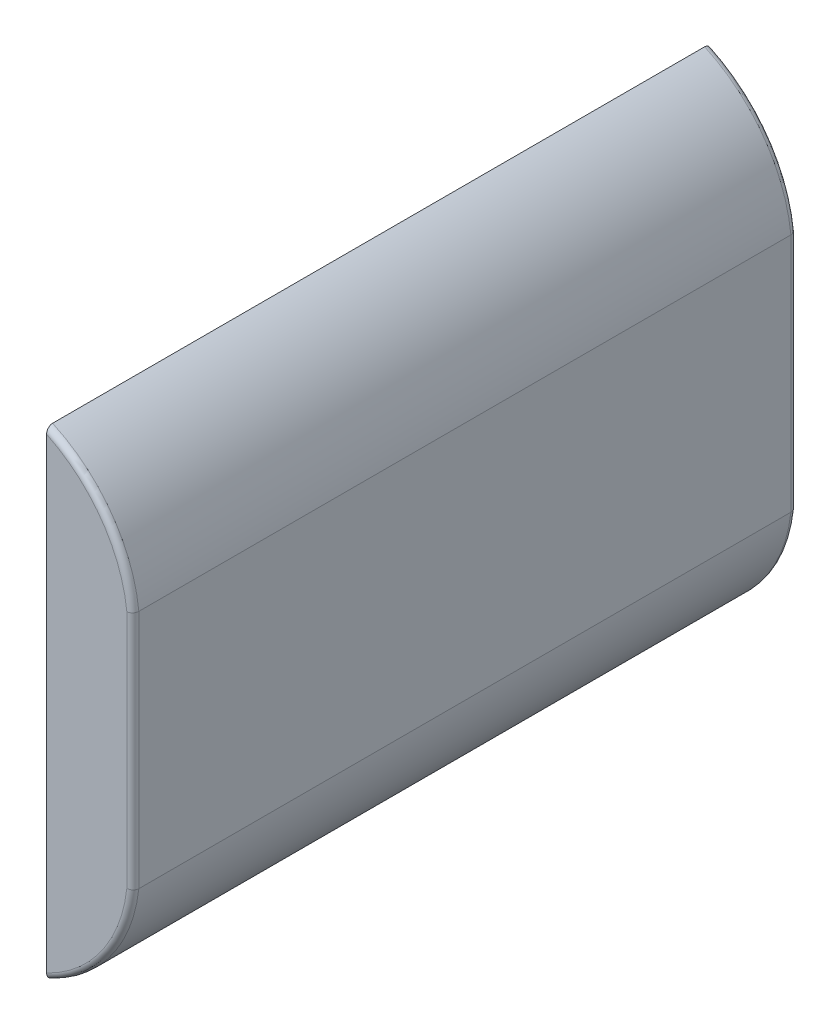
ISO-10303-21;
HEADER;
FILE_DESCRIPTION(('STEP AP214'),'2;1');
FILE_NAME('part.step','',(''),(''),'','','');
FILE_SCHEMA(('AUTOMOTIVE_DESIGN { 1 0 10303 214 1 1 1 1 }'));
ENDSEC;
DATA;
#1=APPLICATION_CONTEXT('core data for automotive mechanical design processes');
#2=APPLICATION_PROTOCOL_DEFINITION('international standard','automotive_design',2000,#1);
#3=PRODUCT_CONTEXT('',#1,'mechanical');
#4=PRODUCT('Part','Part','',(#3));
#5=PRODUCT_RELATED_PRODUCT_CATEGORY('part','',(#4));
#6=PRODUCT_DEFINITION_FORMATION('','',#4);
#7=PRODUCT_DEFINITION_CONTEXT('part definition',#1,'design');
#8=PRODUCT_DEFINITION('design','',#6,#7);
#9=PRODUCT_DEFINITION_SHAPE('','',#8);
#10=(LENGTH_UNIT() NAMED_UNIT(*) SI_UNIT(.MILLI.,.METRE.));
#11=(NAMED_UNIT(*) PLANE_ANGLE_UNIT() SI_UNIT($,.RADIAN.));
#12=(NAMED_UNIT(*) SI_UNIT($,.STERADIAN.) SOLID_ANGLE_UNIT());
#13=UNCERTAINTY_MEASURE_WITH_UNIT(LENGTH_MEASURE(1.E-05),#10,'distance_accuracy_value','');
#14=(GEOMETRIC_REPRESENTATION_CONTEXT(3) GLOBAL_UNCERTAINTY_ASSIGNED_CONTEXT((#13)) GLOBAL_UNIT_ASSIGNED_CONTEXT((#10,
#11,#12)) REPRESENTATION_CONTEXT('',''));
#15=CARTESIAN_POINT('',(0.,0.,0.));
#16=DIRECTION('',(0.,0.,1.));
#17=DIRECTION('',(1.,0.,0.));
#18=AXIS2_PLACEMENT_3D('',#15,#16,#17);
#19=CARTESIAN_POINT('',(0.,0.,110.6));
#20=DIRECTION('',(1.,0.,0.));
#21=DIRECTION('',(0.,0.,-1.));
#22=AXIS2_PLACEMENT_3D('',#19,#20,#21);
#23=PLANE('',#22);
#24=DIRECTION('',(0.,0.,-1.));
#25=VECTOR('',#24,1.);
#26=CARTESIAN_POINT('',(0.,0.,110.6));
#27=LINE('',#26,#25);
#28=CARTESIAN_POINT('',(0.,0.,109.6));
#29=VERTEX_POINT('',#28);
#30=CARTESIAN_POINT('',(0.,0.,1.));
#31=VERTEX_POINT('',#30);
#32=EDGE_CURVE('E166',#29,#31,#27,.T.);
#33=ORIENTED_EDGE('',*,*,#32,.F.);
#34=CARTESIAN_POINT('',(0.,0.,109.6));
#35=CARTESIAN_POINT('',(0.,-1.08799651846304E-06,109.626272334816));
#36=CARTESIAN_POINT('',(0.,0.00113977934455245,109.65253138727));
#37=CARTESIAN_POINT('',(0.,0.00568252953161637,109.704847250998));
#38=CARTESIAN_POINT('',(0.,0.00908389604878885,109.730904107082));
#39=CARTESIAN_POINT('',(0.,0.0226090273595266,109.808318948475));
#40=CARTESIAN_POINT('',(0.,0.0360542489907654,109.859134129471));
#41=CARTESIAN_POINT('',(0.,0.071236565805116,109.95774085126));
#42=CARTESIAN_POINT('',(0.,0.0929704742375248,110.005533545885));
#43=CARTESIAN_POINT('',(0.,0.143889601691275,110.096987112773));
#44=CARTESIAN_POINT('',(0.,0.173078605941792,110.140645870601));
#45=CARTESIAN_POINT('',(0.,0.239043360605673,110.22434878721));
#46=CARTESIAN_POINT('',(0.,0.27605290690079,110.264208078419));
#47=CARTESIAN_POINT('',(0.,0.355757506544396,110.337745180802));
#48=CARTESIAN_POINT('',(0.,0.398453796104587,110.371421644125));
#49=CARTESIAN_POINT('',(0.,0.492213654701837,110.43473000306));
#50=CARTESIAN_POINT('',(0.,0.543681242911641,110.463762909465));
#51=CARTESIAN_POINT('',(0.,0.650474577970152,110.513616583938));
#52=CARTESIAN_POINT('',(0.,0.705803199778973,110.534431154098));
#53=CARTESIAN_POINT('',(0.,0.817942886603018,110.567356852068));
#54=CARTESIAN_POINT('',(0.,0.874712208288021,110.579611230666));
#55=CARTESIAN_POINT('',(0.,0.989313705434746,110.595931466646));
#56=CARTESIAN_POINT('',(0.,1.04714376595589,110.600012138445));
#57=CARTESIAN_POINT('',(0.,1.10495705147508,110.6));
#58=B_SPLINE_CURVE_WITH_KNOTS('',3,(#34,#35,#36,#37,#38,#39,#40,#41,#42,#43,#44,#45,#46,#47,#48,
#49,#50,#51,#52,#53,#54,#55,#56,#57),.UNSPECIFIED.,.F.,.F.,(4,2,2,2,2,2,2,2,2,2,2,4),(0.,
0.0787662157653202,0.157514446434087,0.314380654845202,0.471186613619989,0.62807234743109,
0.790563183127081,0.953089399693553,1.12962729872248,1.30629808172443,1.47993655517551,
1.6532600321612),.UNSPECIFIED.);
#59=CARTESIAN_POINT('',(0.,1.10495705147508,110.6));
#60=VERTEX_POINT('',#59);
#61=EDGE_CURVE('E226',#29,#60,#58,.T.);
#62=ORIENTED_EDGE('',*,*,#61,.T.);
#63=DIRECTION('',(0.,-1.,0.));
#64=VECTOR('',#63,1.);
#65=CARTESIAN_POINT('',(0.,0.,110.6));
#66=LINE('',#65,#64);
#67=CARTESIAN_POINT('',(0.,78.7950429485249,110.6));
#68=VERTEX_POINT('',#67);
#69=EDGE_CURVE('E163',#68,#60,#66,.T.);
#70=ORIENTED_EDGE('',*,*,#69,.F.);
#71=CARTESIAN_POINT('',(0.,78.7950429485249,110.6));
#72=CARTESIAN_POINT('',(0.,78.8624456769818,110.60002474272));
#73=CARTESIAN_POINT('',(0.,78.9298849646688,110.594469660355));
#74=CARTESIAN_POINT('',(0.,79.0631112047222,110.572262518221));
#75=CARTESIAN_POINT('',(0.,79.1288926508186,110.555577528095));
#76=CARTESIAN_POINT('',(0.,79.2567696696953,110.511134003817));
#77=CARTESIAN_POINT('',(0.,79.3188583645859,110.483355506606));
#78=CARTESIAN_POINT('',(0.,79.4370024507866,110.417128880177));
#79=CARTESIAN_POINT('',(0.,79.493065564149,110.378694638585));
#80=CARTESIAN_POINT('',(0.,79.5937162943656,110.294599131112));
#81=CARTESIAN_POINT('',(0.,79.6387995985411,110.249532922222));
#82=CARTESIAN_POINT('',(0.,79.7197590633968,110.151721806559));
#83=CARTESIAN_POINT('',(0.,79.7556370382433,110.098978416003));
#84=CARTESIAN_POINT('',(0.,79.8133448004414,109.992992908201));
#85=CARTESIAN_POINT('',(0.,79.836211536672,109.940313676081));
#86=CARTESIAN_POINT('',(0.,79.8718672736259,109.831699343526));
#87=CARTESIAN_POINT('',(0.,79.8846776637116,109.775771426692));
#88=CARTESIAN_POINT('',(0.,79.8947678544994,109.699447783751));
#89=CARTESIAN_POINT('',(0.,79.896729910866,109.67959352864));
#90=CARTESIAN_POINT('',(0.,79.8993442912994,109.639829605312));
#91=CARTESIAN_POINT('',(0.,79.8999986242182,109.619920069207));
#92=CARTESIAN_POINT('',(0.,79.9,109.6));
#93=B_SPLINE_CURVE_WITH_KNOTS('',3,(#71,#72,#73,#74,#75,#76,#77,#78,#79,#80,#81,#82,#83,#84,#85,
#86,#87,#88,#89,#90,#91,#92),.UNSPECIFIED.,.F.,.F.,(4,2,2,2,2,2,2,2,2,2,4),(0.,
0.202040832621679,0.404682116113837,0.60768971307525,0.810433964114684,1.00062091789273,
1.19077036119936,1.36215465073271,1.53317341897741,1.59299388506299,1.65272238743571),.UNSPECIFIED.);
#94=CARTESIAN_POINT('',(0.,79.9,109.6));
#95=VERTEX_POINT('',#94);
#96=EDGE_CURVE('E220',#68,#95,#93,.T.);
#97=ORIENTED_EDGE('',*,*,#96,.T.);
#98=DIRECTION('',(0.,0.,-1.));
#99=VECTOR('',#98,1.);
#100=CARTESIAN_POINT('',(0.,79.9,110.6));
#101=LINE('',#100,#99);
#102=CARTESIAN_POINT('',(0.,79.9,1.));
#103=VERTEX_POINT('',#102);
#104=EDGE_CURVE('E172',#95,#103,#101,.T.);
#105=ORIENTED_EDGE('',*,*,#104,.T.);
#106=CARTESIAN_POINT('',(0.,79.9,1.));
#107=CARTESIAN_POINT('',(0.,79.9000010879965,0.973727665183909));
#108=CARTESIAN_POINT('',(0.,79.8988602206554,0.947468612730248));
#109=CARTESIAN_POINT('',(0.,79.8943174704684,0.895152749002102));
#110=CARTESIAN_POINT('',(0.,79.8909161039512,0.869095892917911));
#111=CARTESIAN_POINT('',(0.,79.8773909726405,0.791681051525214));
#112=CARTESIAN_POINT('',(0.,79.8639457510092,0.740865870529047));
#113=CARTESIAN_POINT('',(0.,79.8287634341949,0.642259148740017));
#114=CARTESIAN_POINT('',(0.,79.8070295257625,0.594466454114742));
#115=CARTESIAN_POINT('',(0.,79.7561103983087,0.503012887226715));
#116=CARTESIAN_POINT('',(0.,79.7269213940582,0.459354129398735));
#117=CARTESIAN_POINT('',(0.,79.6609566393943,0.375651212790312));
#118=CARTESIAN_POINT('',(0.,79.6239470930992,0.335791921580795));
#119=CARTESIAN_POINT('',(0.,79.5442424934556,0.262254819198293));
#120=CARTESIAN_POINT('',(0.,79.5015462038954,0.228578355874951));
#121=CARTESIAN_POINT('',(0.,79.4077863452982,0.165269996940359));
#122=CARTESIAN_POINT('',(0.,79.3563187570884,0.136237090535357));
#123=CARTESIAN_POINT('',(0.,79.2495254220299,0.0863834160622846));
#124=CARTESIAN_POINT('',(0.,79.194196800221,0.0655688459017625));
#125=CARTESIAN_POINT('',(0.,79.082057113397,0.0326431479315622));
#126=CARTESIAN_POINT('',(0.,79.025287791712,0.02038876933447));
#127=CARTESIAN_POINT('',(0.,78.9106862945653,0.00406853335437581));
#128=CARTESIAN_POINT('',(0.,78.8528562340441,-1.2138445214292E-05));
#129=CARTESIAN_POINT('',(0.,78.7950429485249,0.));
#130=B_SPLINE_CURVE_WITH_KNOTS('',3,(#106,#107,#108,#109,#110,#111,#112,#113,#114,#115,#116,
#117,#118,#119,#120,#121,#122,#123,#124,#125,#126,#127,#128,#129),.UNSPECIFIED.,.F.,.F.,(4,2,2,
2,2,2,2,2,2,2,2,4),(0.,0.0787662157653061,0.157514446434061,0.314380654845193,0.471186613620007,
0.628072347431094,0.79056318312707,0.953089399693543,1.12962729872247,1.30629808172441,
1.47993655517549,1.6532600321612),.UNSPECIFIED.);
#131=CARTESIAN_POINT('',(0.,78.7950429485249,0.));
#132=VERTEX_POINT('',#131);
#133=EDGE_CURVE('E199',#103,#132,#130,.T.);
#134=ORIENTED_EDGE('',*,*,#133,.T.);
#135=DIRECTION('',(0.,-1.,0.));
#136=VECTOR('',#135,1.);
#137=CARTESIAN_POINT('',(0.,0.,0.));
#138=LINE('',#137,#136);
#139=CARTESIAN_POINT('',(0.,1.10495705147508,0.));
#140=VERTEX_POINT('',#139);
#141=EDGE_CURVE('E167',#132,#140,#138,.T.);
#142=ORIENTED_EDGE('',*,*,#141,.T.);
#143=CARTESIAN_POINT('',(0.,1.10495705147508,0.));
#144=CARTESIAN_POINT('',(0.,1.03755432301821,-2.47427200257199E-05));
#145=CARTESIAN_POINT('',(0.,0.970115035331252,0.00553033964526887));
#146=CARTESIAN_POINT('',(0.,0.83688879527781,0.0277374817792062));
#147=CARTESIAN_POINT('',(0.,0.771107349181369,0.044422471904687));
#148=CARTESIAN_POINT('',(0.,0.643230330304724,0.0888659961826639));
#149=CARTESIAN_POINT('',(0.,0.581141635414134,0.11664449339376));
#150=CARTESIAN_POINT('',(0.,0.462997549213377,0.182871119823299));
#151=CARTESIAN_POINT('',(0.,0.406934435850963,0.221305361415079));
#152=CARTESIAN_POINT('',(0.,0.30628370563441,0.30540086888796));
#153=CARTESIAN_POINT('',(0.,0.261200401458897,0.350467077777677));
#154=CARTESIAN_POINT('',(0.,0.180240936603185,0.448278193441358));
#155=CARTESIAN_POINT('',(0.,0.144362961756702,0.501021583996783));
#156=CARTESIAN_POINT('',(0.,0.0866551995585624,0.607007091799195));
#157=CARTESIAN_POINT('',(0.,0.0637884633279871,0.659686323919291));
#158=CARTESIAN_POINT('',(0.,0.0281327263741241,0.768300656473866));
#159=CARTESIAN_POINT('',(0.,0.015322336288431,0.824228573307906));
#160=CARTESIAN_POINT('',(0.,0.00523214550059529,0.9005522162489));
#161=CARTESIAN_POINT('',(0.,0.00327008913402423,0.92040647136046));
#162=CARTESIAN_POINT('',(0.,0.000655708700552523,0.960170394688015));
#163=CARTESIAN_POINT('',(0.,1.37578182343753E-06,0.980079930792728));
#164=CARTESIAN_POINT('',(0.,0.,1.));
#165=B_SPLINE_CURVE_WITH_KNOTS('',3,(#143,#144,#145,#146,#147,#148,#149,#150,#151,#152,#153,
#154,#155,#156,#157,#158,#159,#160,#161,#162,#163,#164),.UNSPECIFIED.,.F.,.F.,(4,2,2,2,2,2,2,2,
2,2,4),(0.,0.202040832621676,0.404682116113837,0.607689713075251,0.810433964114681,
1.00062091789273,1.19077036119936,1.3621546507327,1.5331734189774,1.59299388506299,
1.6527223874357),.UNSPECIFIED.);
#166=EDGE_CURVE('E192',#140,#31,#165,.T.);
#167=ORIENTED_EDGE('',*,*,#166,.T.);
#168=EDGE_LOOP('',(#33,#62,#70,#97,#105,#134,#142,#167));
#169=FACE_BOUND('',#168,.T.);
#170=DIRECTION('',(0.,-1.,0.));
#171=VECTOR('',#170,1.);
#172=CARTESIAN_POINT('',(0.,0.,1.8));
#173=LINE('',#172,#171);
#174=CARTESIAN_POINT('',(0.,77.9033592474587,1.8));
#175=VERTEX_POINT('',#174);
#176=CARTESIAN_POINT('',(0.,1.99664075254128,1.8));
#177=VERTEX_POINT('',#176);
#178=EDGE_CURVE('E148',#175,#177,#173,.T.);
#179=ORIENTED_EDGE('',*,*,#178,.F.);
#180=DIRECTION('',(0.,0.,-1.));
#181=VECTOR('',#180,1.);
#182=CARTESIAN_POINT('',(0.,77.9033592474587,108.8));
#183=LINE('',#182,#181);
#184=CARTESIAN_POINT('',(0.,77.9033592474587,108.8));
#185=VERTEX_POINT('',#184);
#186=EDGE_CURVE('E143',#185,#175,#183,.T.);
#187=ORIENTED_EDGE('',*,*,#186,.F.);
#188=DIRECTION('',(0.,-1.,0.));
#189=VECTOR('',#188,1.);
#190=CARTESIAN_POINT('',(0.,0.,108.8));
#191=LINE('',#190,#189);
#192=CARTESIAN_POINT('',(0.,1.99664075254128,108.8));
#193=VERTEX_POINT('',#192);
#194=EDGE_CURVE('E156',#185,#193,#191,.T.);
#195=ORIENTED_EDGE('',*,*,#194,.T.);
#196=DIRECTION('',(0.,0.,-1.));
#197=VECTOR('',#196,1.);
#198=CARTESIAN_POINT('',(0.,1.99664075254128,108.8));
#199=LINE('',#198,#197);
#200=EDGE_CURVE('E157',#193,#177,#199,.T.);
#201=ORIENTED_EDGE('',*,*,#200,.T.);
#202=EDGE_LOOP('',(#179,#187,#195,#201));
#203=FACE_BOUND('',#202,.T.);
#204=ADVANCED_FACE('F32',(#169,#203),#23,.F.);
#205=CARTESIAN_POINT('',(-10.3617105858602,22.6028396881651,110.6));
#206=DIRECTION('',(0.,0.,-1.));
#207=DIRECTION('',(-1.,0.,0.));
#208=AXIS2_PLACEMENT_3D('',#205,#206,#207);
#209=CYLINDRICAL_SURFACE('',#208,24.8647020539965);
#210=DIRECTION('',(0.,0.,-1.));
#211=VECTOR('',#210,1.);
#212=CARTESIAN_POINT('',(14.3610693917822,19.95,110.6));
#213=LINE('',#212,#211);
#214=CARTESIAN_POINT('',(14.3610693917822,19.95,109.6));
#215=VERTEX_POINT('',#214);
#216=CARTESIAN_POINT('',(14.3610693917822,19.95,1.));
#217=VERTEX_POINT('',#216);
#218=EDGE_CURVE('E178',#215,#217,#213,.T.);
#219=ORIENTED_EDGE('',*,*,#218,.F.);
#220=CARTESIAN_POINT('',(-10.3617105858602,22.6028396881651,109.6));
#221=DIRECTION('',(0.,0.,1.));
#222=DIRECTION('',(1.,0.,0.));
#223=AXIS2_PLACEMENT_3D('',#220,#221,#222);
#224=CIRCLE('',#223,24.8647020539965);
#225=EDGE_CURVE('E190',#215,#29,#224,.F.);
#226=ORIENTED_EDGE('',*,*,#225,.T.);
#227=ORIENTED_EDGE('',*,*,#32,.T.);
#228=CARTESIAN_POINT('',(-10.3617105858602,22.6028396881651,1.));
#229=DIRECTION('',(0.,0.,1.));
#230=DIRECTION('',(1.,0.,0.));
#231=AXIS2_PLACEMENT_3D('',#228,#229,#230);
#232=CIRCLE('',#231,24.8647020539965);
#233=EDGE_CURVE('E188',#31,#217,#232,.T.);
#234=ORIENTED_EDGE('',*,*,#233,.T.);
#235=EDGE_LOOP('',(#219,#226,#227,#234));
#236=FACE_BOUND('',#235,.T.);
#237=ADVANCED_FACE('F210',(#236),#209,.T.);
#238=CARTESIAN_POINT('',(14.3610693917822,19.95,110.6));
#239=DIRECTION('',(-1.,0.,0.));
#240=DIRECTION('',(0.,0.,1.));
#241=AXIS2_PLACEMENT_3D('',#238,#239,#240);
#242=PLANE('',#241);
#243=DIRECTION('',(0.,0.,-1.));
#244=VECTOR('',#243,1.);
#245=CARTESIAN_POINT('',(14.3610693917822,59.95,110.6));
#246=LINE('',#245,#244);
#247=CARTESIAN_POINT('',(14.3610693917822,59.95,109.6));
#248=VERTEX_POINT('',#247);
#249=CARTESIAN_POINT('',(14.3610693917822,59.95,1.));
#250=VERTEX_POINT('',#249);
#251=EDGE_CURVE('E175',#248,#250,#246,.T.);
#252=ORIENTED_EDGE('',*,*,#251,.F.);
#253=DIRECTION('',(0.,1.,0.));
#254=VECTOR('',#253,1.);
#255=CARTESIAN_POINT('',(14.3610693917822,19.95,109.6));
#256=LINE('',#255,#254);
#257=EDGE_CURVE('E306',#248,#215,#256,.F.);
#258=ORIENTED_EDGE('',*,*,#257,.T.);
#259=ORIENTED_EDGE('',*,*,#218,.T.);
#260=DIRECTION('',(0.,1.,0.));
#261=VECTOR('',#260,1.);
#262=CARTESIAN_POINT('',(14.3610693917822,19.95,1.));
#263=LINE('',#262,#261);
#264=EDGE_CURVE('E278',#217,#250,#263,.T.);
#265=ORIENTED_EDGE('',*,*,#264,.T.);
#266=EDGE_LOOP('',(#252,#258,#259,#265));
#267=FACE_BOUND('',#266,.T.);
#268=ADVANCED_FACE('F311',(#267),#242,.F.);
#269=CARTESIAN_POINT('',(-10.3617105858602,57.2971603118349,110.6));
#270=DIRECTION('',(0.,0.,-1.));
#271=DIRECTION('',(-1.,0.,0.));
#272=AXIS2_PLACEMENT_3D('',#269,#270,#271);
#273=CYLINDRICAL_SURFACE('',#272,24.8647020539965);
#274=ORIENTED_EDGE('',*,*,#104,.F.);
#275=CARTESIAN_POINT('',(-10.3617105858602,57.2971603118349,109.6));
#276=DIRECTION('',(0.,0.,1.));
#277=DIRECTION('',(1.,0.,0.));
#278=AXIS2_PLACEMENT_3D('',#275,#276,#277);
#279=CIRCLE('',#278,24.8647020539965);
#280=EDGE_CURVE('E298',#95,#248,#279,.F.);
#281=ORIENTED_EDGE('',*,*,#280,.T.);
#282=ORIENTED_EDGE('',*,*,#251,.T.);
#283=CARTESIAN_POINT('',(-10.3617105858602,57.2971603118349,1.));
#284=DIRECTION('',(0.,0.,1.));
#285=DIRECTION('',(1.,0.,0.));
#286=AXIS2_PLACEMENT_3D('',#283,#284,#285);
#287=CIRCLE('',#286,24.8647020539965);
#288=EDGE_CURVE('E302',#250,#103,#287,.T.);
#289=ORIENTED_EDGE('',*,*,#288,.T.);
#290=EDGE_LOOP('',(#274,#281,#282,#289));
#291=FACE_BOUND('',#290,.T.);
#292=ADVANCED_FACE('F214',(#291),#273,.T.);
#293=CARTESIAN_POINT('',(-10.3617105858602,22.6028396881651,110.6));
#294=DIRECTION('',(0.,0.,1.));
#295=DIRECTION('',(1.,0.,0.));
#296=AXIS2_PLACEMENT_3D('',#293,#294,#295);
#297=PLANE('',#296);
#298=ORIENTED_EDGE('',*,*,#69,.T.);
#299=CARTESIAN_POINT('',(-10.3617105858602,22.6028396881651,110.6));
#300=DIRECTION('',(0.,0.,1.));
#301=DIRECTION('',(1.,0.,0.));
#302=AXIS2_PLACEMENT_3D('',#299,#300,#301);
#303=CIRCLE('',#302,23.8647020539965);
#304=CARTESIAN_POINT('',(13.3610693917822,20.0040487657561,110.6));
#305=VERTEX_POINT('',#304);
#306=EDGE_CURVE('E185',#60,#305,#303,.T.);
#307=ORIENTED_EDGE('',*,*,#306,.T.);
#308=DIRECTION('',(0.,1.,0.));
#309=VECTOR('',#308,1.);
#310=CARTESIAN_POINT('',(13.3610693917822,59.95,110.6));
#311=LINE('',#310,#309);
#312=CARTESIAN_POINT('',(13.3610693917822,59.8959512342439,110.6));
#313=VERTEX_POINT('',#312);
#314=EDGE_CURVE('E183',#305,#313,#311,.T.);
#315=ORIENTED_EDGE('',*,*,#314,.T.);
#316=CARTESIAN_POINT('',(-10.3617105858602,57.2971603118349,110.6));
#317=DIRECTION('',(0.,0.,1.));
#318=DIRECTION('',(1.,0.,0.));
#319=AXIS2_PLACEMENT_3D('',#316,#317,#318);
#320=CIRCLE('',#319,23.8647020539965);
#321=EDGE_CURVE('E181',#313,#68,#320,.T.);
#322=ORIENTED_EDGE('',*,*,#321,.T.);
#323=EDGE_LOOP('',(#298,#307,#315,#322));
#324=FACE_BOUND('',#323,.T.);
#325=ADVANCED_FACE('F291',(#324),#297,.T.);
#326=CARTESIAN_POINT('',(-10.3617105858602,22.6028396881651,0.));
#327=DIRECTION('',(0.,0.,1.));
#328=DIRECTION('',(1.,0.,0.));
#329=AXIS2_PLACEMENT_3D('',#326,#327,#328);
#330=PLANE('',#329);
#331=ORIENTED_EDGE('',*,*,#141,.F.);
#332=CARTESIAN_POINT('',(-10.3617105858602,57.2971603118349,0.));
#333=DIRECTION('',(0.,0.,1.));
#334=DIRECTION('',(1.,0.,0.));
#335=AXIS2_PLACEMENT_3D('',#332,#333,#334);
#336=CIRCLE('',#335,23.8647020539965);
#337=CARTESIAN_POINT('',(13.3610693917822,59.8959512342439,0.));
#338=VERTEX_POINT('',#337);
#339=EDGE_CURVE('E11',#132,#338,#336,.F.);
#340=ORIENTED_EDGE('',*,*,#339,.T.);
#341=DIRECTION('',(0.,1.,0.));
#342=VECTOR('',#341,1.);
#343=CARTESIAN_POINT('',(13.3610693917822,22.6028396881651,0.));
#344=LINE('',#343,#342);
#345=CARTESIAN_POINT('',(13.3610693917822,20.0040487657561,0.));
#346=VERTEX_POINT('',#345);
#347=EDGE_CURVE('E46',#338,#346,#344,.F.);
#348=ORIENTED_EDGE('',*,*,#347,.T.);
#349=CARTESIAN_POINT('',(-10.3617105858602,22.6028396881651,0.));
#350=DIRECTION('',(0.,0.,1.));
#351=DIRECTION('',(1.,0.,0.));
#352=AXIS2_PLACEMENT_3D('',#349,#350,#351);
#353=CIRCLE('',#352,23.8647020539965);
#354=EDGE_CURVE('E301',#346,#140,#353,.F.);
#355=ORIENTED_EDGE('',*,*,#354,.T.);
#356=EDGE_LOOP('',(#331,#340,#348,#355));
#357=FACE_BOUND('',#356,.T.);
#358=ADVANCED_FACE('F212',(#357),#330,.F.);
#359=CARTESIAN_POINT('',(-10.3617105858602,22.6028396881651,110.6));
#360=DIRECTION('',(0.,0.,-1.));
#361=DIRECTION('',(-1.,0.,0.));
#362=AXIS2_PLACEMENT_3D('',#359,#360,#361);
#363=CYLINDRICAL_SURFACE('',#362,23.0647020539965);
#364=CARTESIAN_POINT('',(-10.3617105858602,22.6028396881651,1.8));
#365=DIRECTION('',(0.,0.,1.));
#366=DIRECTION('',(1.,0.,0.));
#367=AXIS2_PLACEMENT_3D('',#364,#365,#366);
#368=CIRCLE('',#367,23.0647020539965);
#369=CARTESIAN_POINT('',(12.5610693917822,20.048110947921,1.8));
#370=VERTEX_POINT('',#369);
#371=EDGE_CURVE('E130',#177,#370,#368,.T.);
#372=ORIENTED_EDGE('',*,*,#371,.F.);
#373=ORIENTED_EDGE('',*,*,#200,.F.);
#374=CARTESIAN_POINT('',(-10.3617105858602,22.6028396881651,108.8));
#375=DIRECTION('',(0.,0.,1.));
#376=DIRECTION('',(1.,0.,0.));
#377=AXIS2_PLACEMENT_3D('',#374,#375,#376);
#378=CIRCLE('',#377,23.0647020539965);
#379=CARTESIAN_POINT('',(12.5610693917822,20.048110947921,108.8));
#380=VERTEX_POINT('',#379);
#381=EDGE_CURVE('E150',#193,#380,#378,.T.);
#382=ORIENTED_EDGE('',*,*,#381,.T.);
#383=DIRECTION('',(0.,0.,-1.));
#384=VECTOR('',#383,1.);
#385=CARTESIAN_POINT('',(12.5610693917822,20.048110947921,108.8));
#386=LINE('',#385,#384);
#387=EDGE_CURVE('E142',#380,#370,#386,.T.);
#388=ORIENTED_EDGE('',*,*,#387,.T.);
#389=EDGE_LOOP('',(#372,#373,#382,#388));
#390=FACE_BOUND('',#389,.T.);
#391=ADVANCED_FACE('F361',(#390),#363,.F.);
#392=CARTESIAN_POINT('',(12.5610693917822,19.95,110.6));
#393=DIRECTION('',(-1.,0.,0.));
#394=DIRECTION('',(0.,0.,1.));
#395=AXIS2_PLACEMENT_3D('',#392,#393,#394);
#396=PLANE('',#395);
#397=DIRECTION('',(0.,1.,0.));
#398=VECTOR('',#397,1.);
#399=CARTESIAN_POINT('',(12.5610693917822,19.95,1.8));
#400=LINE('',#399,#398);
#401=CARTESIAN_POINT('',(12.5610693917822,59.851889052079,1.8));
#402=VERTEX_POINT('',#401);
#403=EDGE_CURVE('E123',#370,#402,#400,.T.);
#404=ORIENTED_EDGE('',*,*,#403,.F.);
#405=ORIENTED_EDGE('',*,*,#387,.F.);
#406=DIRECTION('',(0.,1.,0.));
#407=VECTOR('',#406,1.);
#408=CARTESIAN_POINT('',(12.5610693917822,19.95,108.8));
#409=LINE('',#408,#407);
#410=CARTESIAN_POINT('',(12.5610693917822,59.851889052079,108.8));
#411=VERTEX_POINT('',#410);
#412=EDGE_CURVE('E138',#380,#411,#409,.T.);
#413=ORIENTED_EDGE('',*,*,#412,.T.);
#414=DIRECTION('',(0.,0.,-1.));
#415=VECTOR('',#414,1.);
#416=CARTESIAN_POINT('',(12.5610693917822,59.851889052079,108.8));
#417=LINE('',#416,#415);
#418=EDGE_CURVE('E136',#411,#402,#417,.T.);
#419=ORIENTED_EDGE('',*,*,#418,.T.);
#420=EDGE_LOOP('',(#404,#405,#413,#419));
#421=FACE_BOUND('',#420,.T.);
#422=ADVANCED_FACE('F137',(#421),#396,.T.);
#423=CARTESIAN_POINT('',(-10.3617105858602,57.2971603118349,110.6));
#424=DIRECTION('',(0.,0.,-1.));
#425=DIRECTION('',(-1.,0.,0.));
#426=AXIS2_PLACEMENT_3D('',#423,#424,#425);
#427=CYLINDRICAL_SURFACE('',#426,23.0647020539965);
#428=CARTESIAN_POINT('',(-10.3617105858602,57.2971603118349,1.8));
#429=DIRECTION('',(0.,0.,1.));
#430=DIRECTION('',(1.,0.,0.));
#431=AXIS2_PLACEMENT_3D('',#428,#429,#430);
#432=CIRCLE('',#431,23.0647020539965);
#433=EDGE_CURVE('E127',#402,#175,#432,.T.);
#434=ORIENTED_EDGE('',*,*,#433,.F.);
#435=ORIENTED_EDGE('',*,*,#418,.F.);
#436=CARTESIAN_POINT('',(-10.3617105858602,57.2971603118349,108.8));
#437=DIRECTION('',(0.,0.,1.));
#438=DIRECTION('',(1.,0.,0.));
#439=AXIS2_PLACEMENT_3D('',#436,#437,#438);
#440=CIRCLE('',#439,23.0647020539965);
#441=EDGE_CURVE('E154',#411,#185,#440,.T.);
#442=ORIENTED_EDGE('',*,*,#441,.T.);
#443=ORIENTED_EDGE('',*,*,#186,.T.);
#444=EDGE_LOOP('',(#434,#435,#442,#443));
#445=FACE_BOUND('',#444,.T.);
#446=ADVANCED_FACE('F145',(#445),#427,.F.);
#447=CARTESIAN_POINT('',(-10.3617105858602,22.6028396881651,108.8));
#448=DIRECTION('',(0.,0.,1.));
#449=DIRECTION('',(1.,0.,0.));
#450=AXIS2_PLACEMENT_3D('',#447,#448,#449);
#451=PLANE('',#450);
#452=ORIENTED_EDGE('',*,*,#381,.F.);
#453=ORIENTED_EDGE('',*,*,#194,.F.);
#454=ORIENTED_EDGE('',*,*,#441,.F.);
#455=ORIENTED_EDGE('',*,*,#412,.F.);
#456=EDGE_LOOP('',(#452,#453,#454,#455));
#457=FACE_BOUND('',#456,.T.);
#458=ADVANCED_FACE('F340',(#457),#451,.F.);
#459=CARTESIAN_POINT('',(-10.3617105858602,22.6028396881651,1.8));
#460=DIRECTION('',(0.,0.,1.));
#461=DIRECTION('',(1.,0.,0.));
#462=AXIS2_PLACEMENT_3D('',#459,#460,#461);
#463=PLANE('',#462);
#464=ORIENTED_EDGE('',*,*,#371,.T.);
#465=ORIENTED_EDGE('',*,*,#403,.T.);
#466=ORIENTED_EDGE('',*,*,#433,.T.);
#467=ORIENTED_EDGE('',*,*,#178,.T.);
#468=EDGE_LOOP('',(#464,#465,#466,#467));
#469=FACE_BOUND('',#468,.T.);
#470=ADVANCED_FACE('F125',(#469),#463,.T.);
#471=CARTESIAN_POINT('',(-10.3617105858602,57.2971603118349,109.6));
#472=DIRECTION('',(0.,0.,1.));
#473=DIRECTION('',(1.,0.,0.));
#474=AXIS2_PLACEMENT_3D('',#471,#472,#473);
#475=TOROIDAL_SURFACE('',#474,23.8647020539965,1.);
#476=ORIENTED_EDGE('',*,*,#96,.F.);
#477=ORIENTED_EDGE('',*,*,#321,.F.);
#478=CARTESIAN_POINT('',(14.3610693917822,59.95,109.6));
#479=CARTESIAN_POINT('',(14.3610692255251,59.9499999837312,109.628104411456));
#480=CARTESIAN_POINT('',(14.3598838594909,59.9499365769979,109.656195347992));
#481=CARTESIAN_POINT('',(14.3551550941738,59.9496835814782,109.712176003288));
#482=CARTESIAN_POINT('',(14.3516118142943,59.9494939990813,109.740065732164));
#483=CARTESIAN_POINT('',(14.3374787572951,59.9487376949865,109.823086214119));
#484=CARTESIAN_POINT('',(14.3233856701845,59.9479834118112,109.87766047394));
#485=CARTESIAN_POINT('',(14.2862519414538,59.9459945634953,109.983662577826));
#486=CARTESIAN_POINT('',(14.26320715194,59.9447597757059,110.035088950468));
#487=CARTESIAN_POINT('',(14.208832341806,59.9418434559301,110.133336320549));
#488=CARTESIAN_POINT('',(14.1775042081226,59.940162025688,110.18015836352));
#489=CARTESIAN_POINT('',(14.1074343234983,59.9363967764675,110.267902912826));
#490=CARTESIAN_POINT('',(14.0686883503928,59.9343127283166,110.308822035902));
#491=CARTESIAN_POINT('',(13.9848797545516,59.9297985827344,110.383590762887));
#492=CARTESIAN_POINT('',(13.9398149335351,59.9273683648685,110.417437896254));
#493=CARTESIAN_POINT('',(13.844588086366,59.922225041238,110.477140135805));
#494=CARTESIAN_POINT('',(13.7944177830393,59.9195114759093,110.50298198023));
#495=CARTESIAN_POINT('',(13.6904828481206,59.9138804408757,110.54585397094));
#496=CARTESIAN_POINT('',(13.6367215559142,59.9109631605007,110.562892178672));
#497=CARTESIAN_POINT('',(13.5488352156913,59.9061857539868,110.582803119263));
#498=CARTESIAN_POINT('',(13.5153421387049,59.9043632305306,110.588612833952));
#499=CARTESIAN_POINT('',(13.447972205965,59.9006933852248,110.596792504539));
#500=CARTESIAN_POINT('',(13.4140959948883,59.8988461042764,110.599167562079));
#501=CARTESIAN_POINT('',(13.3738274731949,59.896647893696,110.599939087913));
#502=CARTESIAN_POINT('',(13.3674479911679,59.8962995751911,110.600000162709));
#503=CARTESIAN_POINT('',(13.3610693917822,59.8959512342439,110.6));
#504=B_SPLINE_CURVE_WITH_KNOTS('',3,(#478,#479,#480,#481,#482,#483,#484,#485,#486,#487,#488,
#489,#490,#491,#492,#493,#494,#495,#496,#497,#498,#499,#500,#501,#502,#503),.UNSPECIFIED.,.F.,
.F.,(4,2,2,2,2,2,2,2,2,2,2,2,4),(0.,0.0842614128497324,0.168518559082211,0.336759740534606,
0.505078972010761,0.673359893536119,0.841736885301108,1.01017260019982,1.17888587577748,
1.34744438640987,1.44942094289932,1.5512458731429,1.57041234423552),.UNSPECIFIED.);
#505=EDGE_CURVE('E244',#248,#313,#504,.T.);
#506=ORIENTED_EDGE('',*,*,#505,.F.);
#507=ORIENTED_EDGE('',*,*,#280,.F.);
#508=EDGE_LOOP('',(#476,#477,#506,#507));
#509=FACE_BOUND('',#508,.T.);
#510=ADVANCED_FACE('F233',(#509),#475,.T.);
#511=CARTESIAN_POINT('',(13.3610693917822,22.6028396881651,109.6));
#512=DIRECTION('',(0.,-1.,0.));
#513=DIRECTION('',(0.,0.,-1.));
#514=AXIS2_PLACEMENT_3D('',#511,#512,#513);
#515=CYLINDRICAL_SURFACE('',#514,1.);
#516=ORIENTED_EDGE('',*,*,#505,.T.);
#517=ORIENTED_EDGE('',*,*,#314,.F.);
#518=CARTESIAN_POINT('',(14.3610693917822,19.95,109.6));
#519=CARTESIAN_POINT('',(14.3610692255251,19.9500000162688,109.628104411456));
#520=CARTESIAN_POINT('',(14.3598838594909,19.9500634230021,109.656195347992));
#521=CARTESIAN_POINT('',(14.3551550941738,19.9503164185218,109.712176003288));
#522=CARTESIAN_POINT('',(14.3516118142943,19.9505060009187,109.740065732164));
#523=CARTESIAN_POINT('',(14.3374787572951,19.9512623050135,109.823086214119));
#524=CARTESIAN_POINT('',(14.3233856701845,19.9520165881888,109.87766047394));
#525=CARTESIAN_POINT('',(14.2862519414538,19.9540054365047,109.983662577826));
#526=CARTESIAN_POINT('',(14.26320715194,19.9552402242941,110.035088950468));
#527=CARTESIAN_POINT('',(14.208832341806,19.9581565440699,110.133336320549));
#528=CARTESIAN_POINT('',(14.1775042081226,19.959837974312,110.18015836352));
#529=CARTESIAN_POINT('',(14.1074343234983,19.9636032235325,110.267902912826));
#530=CARTESIAN_POINT('',(14.0686883503928,19.9656872716834,110.308822035902));
#531=CARTESIAN_POINT('',(13.9848797545516,19.9702014172655,110.383590762887));
#532=CARTESIAN_POINT('',(13.9398149335351,19.9726316351315,110.417437896254));
#533=CARTESIAN_POINT('',(13.844588086366,19.977774958762,110.477140135805));
#534=CARTESIAN_POINT('',(13.7944177830393,19.9804885240907,110.50298198023));
#535=CARTESIAN_POINT('',(13.6904828481206,19.9861195591244,110.54585397094));
#536=CARTESIAN_POINT('',(13.6367215559142,19.9890368394993,110.562892178672));
#537=CARTESIAN_POINT('',(13.5488352156913,19.9938142460133,110.582803119263));
#538=CARTESIAN_POINT('',(13.5153421387049,19.9956367694694,110.588612833952));
#539=CARTESIAN_POINT('',(13.447972205965,19.9993066147752,110.596792504539));
#540=CARTESIAN_POINT('',(13.4140959948883,20.0011538957235,110.599167562079));
#541=CARTESIAN_POINT('',(13.3738274731949,20.003352106304,110.599939087913));
#542=CARTESIAN_POINT('',(13.3674479911679,20.0037004248089,110.600000162709));
#543=CARTESIAN_POINT('',(13.3610693917822,20.0040487657561,110.6));
#544=B_SPLINE_CURVE_WITH_KNOTS('',3,(#518,#519,#520,#521,#522,#523,#524,#525,#526,#527,#528,
#529,#530,#531,#532,#533,#534,#535,#536,#537,#538,#539,#540,#541,#542,#543),.UNSPECIFIED.,.F.,
.F.,(4,2,2,2,2,2,2,2,2,2,2,2,4),(0.,0.0842614128497324,0.168518559082211,0.336759740534606,
0.505078972010776,0.67335989353612,0.841736885301111,1.01017260019982,1.17888587577748,
1.34744438640987,1.44942094289933,1.5512458731429,1.57041234423552),.UNSPECIFIED.);
#545=EDGE_CURVE('E251',#215,#305,#544,.T.);
#546=ORIENTED_EDGE('',*,*,#545,.F.);
#547=ORIENTED_EDGE('',*,*,#257,.F.);
#548=EDGE_LOOP('',(#516,#517,#546,#547));
#549=FACE_BOUND('',#548,.T.);
#550=ADVANCED_FACE('F237',(#549),#515,.T.);
#551=CARTESIAN_POINT('',(-10.3617105858602,22.6028396881651,109.6));
#552=DIRECTION('',(0.,0.,1.));
#553=DIRECTION('',(1.,0.,0.));
#554=AXIS2_PLACEMENT_3D('',#551,#552,#553);
#555=TOROIDAL_SURFACE('',#554,23.8647020539965,1.);
#556=ORIENTED_EDGE('',*,*,#61,.F.);
#557=ORIENTED_EDGE('',*,*,#225,.F.);
#558=ORIENTED_EDGE('',*,*,#545,.T.);
#559=ORIENTED_EDGE('',*,*,#306,.F.);
#560=EDGE_LOOP('',(#556,#557,#558,#559));
#561=FACE_BOUND('',#560,.T.);
#562=ADVANCED_FACE('F272',(#561),#555,.T.);
#563=CARTESIAN_POINT('',(-10.3617105858602,22.6028396881651,1.));
#564=DIRECTION('',(0.,0.,1.));
#565=DIRECTION('',(1.,0.,0.));
#566=AXIS2_PLACEMENT_3D('',#563,#564,#565);
#567=TOROIDAL_SURFACE('',#566,23.8647020539965,1.);
#568=ORIENTED_EDGE('',*,*,#166,.F.);
#569=ORIENTED_EDGE('',*,*,#354,.F.);
#570=CARTESIAN_POINT('',(14.3610693917822,19.95,1.));
#571=CARTESIAN_POINT('',(14.3610692255251,19.9500000162688,0.9718955885441));
#572=CARTESIAN_POINT('',(14.3598838594909,19.9500634230021,0.943804652007808));
#573=CARTESIAN_POINT('',(14.3551550941738,19.9503164185218,0.887823996712256));
#574=CARTESIAN_POINT('',(14.3516118142943,19.9505060009187,0.859934267836261));
#575=CARTESIAN_POINT('',(14.3374787572951,19.9512623050134,0.776913785881499));
#576=CARTESIAN_POINT('',(14.3233856701845,19.9520165881888,0.722339526059815));
#577=CARTESIAN_POINT('',(14.2862519414538,19.9540054365047,0.616337422173514));
#578=CARTESIAN_POINT('',(14.26320715194,19.955240224294,0.564911049531585));
#579=CARTESIAN_POINT('',(14.208832341806,19.9581565440698,0.466663679451099));
#580=CARTESIAN_POINT('',(14.1775042081226,19.959837974312,0.419841636479682));
#581=CARTESIAN_POINT('',(14.1074343234983,19.9636032235325,0.332097087173763));
#582=CARTESIAN_POINT('',(14.0686883503928,19.9656872716834,0.291177964097938));
#583=CARTESIAN_POINT('',(13.9848797545516,19.9702014172656,0.216409237113073));
#584=CARTESIAN_POINT('',(13.9398149335351,19.9726316351315,0.182562103745583));
#585=CARTESIAN_POINT('',(13.844588086366,19.977774958762,0.122859864195098));
#586=CARTESIAN_POINT('',(13.7944177830393,19.9804885240906,0.0970180197698973));
#587=CARTESIAN_POINT('',(13.6904828481206,19.9861195591244,0.0541460290603314));
#588=CARTESIAN_POINT('',(13.6367215559143,19.9890368394994,0.0371078213284328));
#589=CARTESIAN_POINT('',(13.5488352156913,19.9938142460132,0.0171968807367209));
#590=CARTESIAN_POINT('',(13.5153421387049,19.9956367694693,0.0113871660477679));
#591=CARTESIAN_POINT('',(13.447972205965,19.9993066147752,0.00320749546105885));
#592=CARTESIAN_POINT('',(13.4140959948883,20.0011538957238,0.000832437920969765));
#593=CARTESIAN_POINT('',(13.3738274731949,20.0033521063041,6.09120871732074E-05));
#594=CARTESIAN_POINT('',(13.3674479911679,20.0037004248089,-1.62708980081108E-07));
#595=CARTESIAN_POINT('',(13.3610693917822,20.0040487657561,0.));
#596=B_SPLINE_CURVE_WITH_KNOTS('',3,(#570,#571,#572,#573,#574,#575,#576,#577,#578,#579,#580,
#581,#582,#583,#584,#585,#586,#587,#588,#589,#590,#591,#592,#593,#594,#595),.UNSPECIFIED.,.F.,
.F.,(4,2,2,2,2,2,2,2,2,2,2,2,4),(0.,0.0842614128497316,0.168518559082204,0.3367597405346,
0.505078972010769,0.673359893536115,0.841736885301111,1.01017260019982,1.17888587577748,
1.34744438640986,1.44942094289932,1.5512458731429,1.57041234423552),.UNSPECIFIED.);
#597=EDGE_CURVE('E37',#217,#346,#596,.T.);
#598=ORIENTED_EDGE('',*,*,#597,.F.);
#599=ORIENTED_EDGE('',*,*,#233,.F.);
#600=EDGE_LOOP('',(#568,#569,#598,#599));
#601=FACE_BOUND('',#600,.T.);
#602=ADVANCED_FACE('F34',(#601),#567,.T.);
#603=CARTESIAN_POINT('',(13.3610693917822,19.95,1.));
#604=DIRECTION('',(0.,1.,0.));
#605=DIRECTION('',(0.,0.,1.));
#606=AXIS2_PLACEMENT_3D('',#603,#604,#605);
#607=CYLINDRICAL_SURFACE('',#606,1.);
#608=ORIENTED_EDGE('',*,*,#597,.T.);
#609=ORIENTED_EDGE('',*,*,#347,.F.);
#610=CARTESIAN_POINT('',(14.3610693917822,59.95,1.));
#611=CARTESIAN_POINT('',(14.3610692255251,59.9499999837312,0.9718955885441));
#612=CARTESIAN_POINT('',(14.3598838594909,59.9499365769979,0.943804652007808));
#613=CARTESIAN_POINT('',(14.3551550941738,59.9496835814782,0.887823996712257));
#614=CARTESIAN_POINT('',(14.3516118142943,59.9494939990813,0.859934267836261));
#615=CARTESIAN_POINT('',(14.3374787572951,59.9487376949866,0.7769137858815));
#616=CARTESIAN_POINT('',(14.3233856701845,59.9479834118112,0.722339526059815));
#617=CARTESIAN_POINT('',(14.2862519414538,59.9459945634953,0.616337422173515));
#618=CARTESIAN_POINT('',(14.26320715194,59.9447597757059,0.564911049531587));
#619=CARTESIAN_POINT('',(14.208832341806,59.9418434559301,0.466663679451101));
#620=CARTESIAN_POINT('',(14.1775042081226,59.940162025688,0.419841636479683));
#621=CARTESIAN_POINT('',(14.1074343234983,59.9363967764675,0.332097087173763));
#622=CARTESIAN_POINT('',(14.0686883503928,59.9343127283166,0.291177964097938));
#623=CARTESIAN_POINT('',(13.9848797545516,59.9297985827344,0.216409237113073));
#624=CARTESIAN_POINT('',(13.9398149335351,59.9273683648685,0.182562103745583));
#625=CARTESIAN_POINT('',(13.844588086366,59.922225041238,0.122859864195098));
#626=CARTESIAN_POINT('',(13.7944177830393,59.9195114759093,0.0970180197698976));
#627=CARTESIAN_POINT('',(13.6904828481206,59.9138804408757,0.0541460290603312));
#628=CARTESIAN_POINT('',(13.6367215559142,59.9109631605007,0.0371078213284319));
#629=CARTESIAN_POINT('',(13.5488352156913,59.9061857539868,0.0171968807367203));
#630=CARTESIAN_POINT('',(13.5153421387049,59.9043632305307,0.0113871660477678));
#631=CARTESIAN_POINT('',(13.447972205965,59.9006933852248,0.00320749546105895));
#632=CARTESIAN_POINT('',(13.4140959948883,59.8988461042762,0.000832437920969913));
#633=CARTESIAN_POINT('',(13.3738274731949,59.8966478936959,6.09120871732722E-05));
#634=CARTESIAN_POINT('',(13.3674479911679,59.8962995751911,-1.62708980037011E-07));
#635=CARTESIAN_POINT('',(13.3610693917822,59.8959512342439,0.));
#636=B_SPLINE_CURVE_WITH_KNOTS('',3,(#610,#611,#612,#613,#614,#615,#616,#617,#618,#619,#620,
#621,#622,#623,#624,#625,#626,#627,#628,#629,#630,#631,#632,#633,#634,#635),.UNSPECIFIED.,.F.,
.F.,(4,2,2,2,2,2,2,2,2,2,2,2,4),(0.,0.0842614128497311,0.168518559082204,0.3367597405346,
0.505078972010766,0.673359893536114,0.841736885301111,1.01017260019982,1.17888587577748,
1.34744438640986,1.44942094289932,1.55124587314291,1.57041234423552),.UNSPECIFIED.);
#637=EDGE_CURVE('E256',#250,#338,#636,.T.);
#638=ORIENTED_EDGE('',*,*,#637,.F.);
#639=ORIENTED_EDGE('',*,*,#264,.F.);
#640=EDGE_LOOP('',(#608,#609,#638,#639));
#641=FACE_BOUND('',#640,.T.);
#642=ADVANCED_FACE('F262',(#641),#607,.T.);
#643=CARTESIAN_POINT('',(-10.3617105858602,57.2971603118349,1.));
#644=DIRECTION('',(0.,0.,1.));
#645=DIRECTION('',(1.,0.,0.));
#646=AXIS2_PLACEMENT_3D('',#643,#644,#645);
#647=TOROIDAL_SURFACE('',#646,23.8647020539965,1.);
#648=ORIENTED_EDGE('',*,*,#637,.T.);
#649=ORIENTED_EDGE('',*,*,#339,.F.);
#650=ORIENTED_EDGE('',*,*,#133,.F.);
#651=ORIENTED_EDGE('',*,*,#288,.F.);
#652=EDGE_LOOP('',(#648,#649,#650,#651));
#653=FACE_BOUND('',#652,.T.);
#654=ADVANCED_FACE('F240',(#653),#647,.T.);
#655=CLOSED_SHELL('',(#204,#237,#268,#292,#325,#358,#391,#422,#446,#458,#470,#510,#550,#562,
#602,#642,#654));
#656=MANIFOLD_SOLID_BREP('B2',#655);
#657=ADVANCED_BREP_SHAPE_REPRESENTATION('',(#18,#656),#14);
#658=SHAPE_DEFINITION_REPRESENTATION(#9,#657);
ENDSEC;
END-ISO-10303-21;
